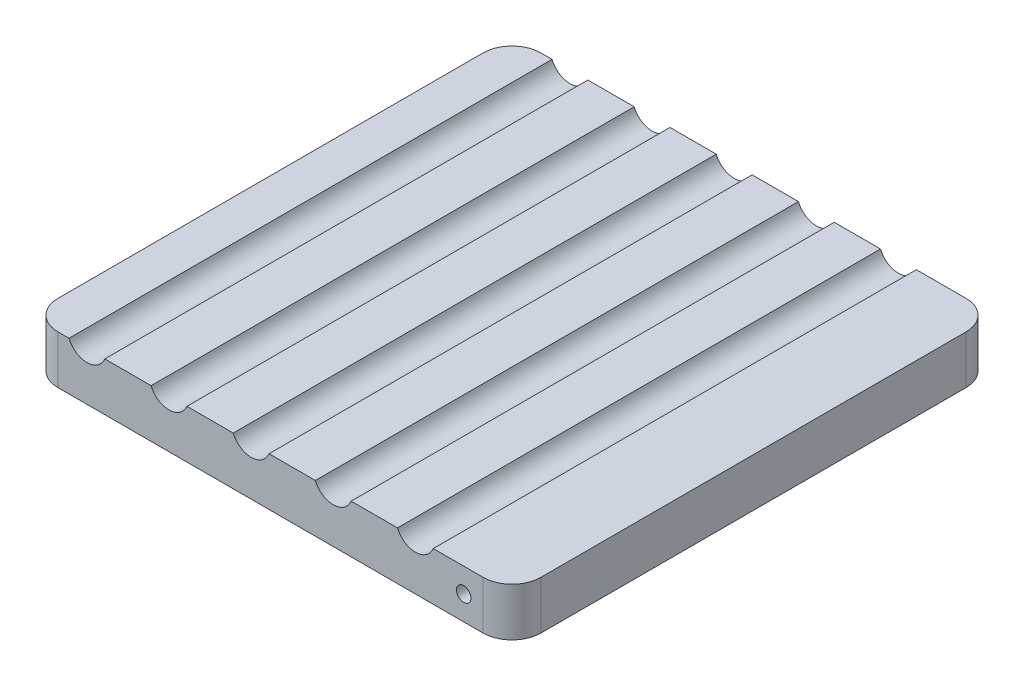
ISO-10303-21;
HEADER;
FILE_DESCRIPTION(('STEP AP214'),'2;1');
FILE_NAME('part.step','',(''),(''),'','','');
FILE_SCHEMA(('AUTOMOTIVE_DESIGN { 1 0 10303 214 1 1 1 1 }'));
ENDSEC;
DATA;
#1=APPLICATION_CONTEXT('core data for automotive mechanical design processes');
#2=APPLICATION_PROTOCOL_DEFINITION('international standard','automotive_design',2000,#1);
#3=PRODUCT_CONTEXT('',#1,'mechanical');
#4=PRODUCT('Part','Part','',(#3));
#5=PRODUCT_RELATED_PRODUCT_CATEGORY('part','',(#4));
#6=PRODUCT_DEFINITION_FORMATION('','',#4);
#7=PRODUCT_DEFINITION_CONTEXT('part definition',#1,'design');
#8=PRODUCT_DEFINITION('design','',#6,#7);
#9=PRODUCT_DEFINITION_SHAPE('','',#8);
#10=(LENGTH_UNIT() NAMED_UNIT(*) SI_UNIT(.MILLI.,.METRE.));
#11=(NAMED_UNIT(*) PLANE_ANGLE_UNIT() SI_UNIT($,.RADIAN.));
#12=(NAMED_UNIT(*) SI_UNIT($,.STERADIAN.) SOLID_ANGLE_UNIT());
#13=UNCERTAINTY_MEASURE_WITH_UNIT(LENGTH_MEASURE(1.E-05),#10,'distance_accuracy_value','');
#14=(GEOMETRIC_REPRESENTATION_CONTEXT(3) GLOBAL_UNCERTAINTY_ASSIGNED_CONTEXT((#13)) GLOBAL_UNIT_ASSIGNED_CONTEXT((#10,
#11,#12)) REPRESENTATION_CONTEXT('',''));
#15=CARTESIAN_POINT('',(0.,0.,0.));
#16=DIRECTION('',(0.,0.,1.));
#17=DIRECTION('',(1.,0.,0.));
#18=AXIS2_PLACEMENT_3D('',#15,#16,#17);
#19=CARTESIAN_POINT('',(0.,12.7,0.));
#20=DIRECTION('',(0.,-1.,0.));
#21=DIRECTION('',(0.,0.,-1.));
#22=AXIS2_PLACEMENT_3D('',#19,#20,#21);
#23=PLANE('',#22);
#24=DIRECTION('',(-1.,0.,0.));
#25=VECTOR('',#24,1.);
#26=CARTESIAN_POINT('',(-63.5,12.7,-63.5));
#27=LINE('',#26,#25);
#28=CARTESIAN_POINT('',(33.3907139606943,12.7,-63.5));
#29=VERTEX_POINT('',#28);
#30=CARTESIAN_POINT('',(21.2192860393058,12.7,-63.5));
#31=VERTEX_POINT('',#30);
#32=EDGE_CURVE('E222',#29,#31,#27,.T.);
#33=ORIENTED_EDGE('',*,*,#32,.T.);
#34=DIRECTION('',(0.,0.,1.));
#35=VECTOR('',#34,1.);
#36=CARTESIAN_POINT('',(21.2192860393058,12.7,-63.5));
#37=LINE('',#36,#35);
#38=CARTESIAN_POINT('',(21.2192860393058,12.7,63.5));
#39=VERTEX_POINT('',#38);
#40=EDGE_CURVE('E13',#31,#39,#37,.T.);
#41=ORIENTED_EDGE('',*,*,#40,.T.);
#42=DIRECTION('',(1.,0.,0.));
#43=VECTOR('',#42,1.);
#44=CARTESIAN_POINT('',(-63.5,12.7,63.5));
#45=LINE('',#44,#43);
#46=CARTESIAN_POINT('',(33.3907139606943,12.7,63.5));
#47=VERTEX_POINT('',#46);
#48=EDGE_CURVE('E206',#39,#47,#45,.T.);
#49=ORIENTED_EDGE('',*,*,#48,.T.);
#50=DIRECTION('',(0.,0.,1.));
#51=VECTOR('',#50,1.);
#52=CARTESIAN_POINT('',(33.3907139606943,12.7,-63.5));
#53=LINE('',#52,#51);
#54=EDGE_CURVE('E345',#47,#29,#53,.F.);
#55=ORIENTED_EDGE('',*,*,#54,.T.);
#56=EDGE_LOOP('',(#33,#41,#49,#55));
#57=FACE_BOUND('',#56,.T.);
#58=ADVANCED_FACE('F54',(#57),#23,.F.);
#59=CARTESIAN_POINT('',(-0.370713960694222,12.7,63.5));
#60=VERTEX_POINT('',#59);
#61=CARTESIAN_POINT('',(11.8007139606943,12.7,63.5));
#62=VERTEX_POINT('',#61);
#63=EDGE_CURVE('E213',#60,#62,#45,.T.);
#64=ORIENTED_EDGE('',*,*,#63,.T.);
#65=DIRECTION('',(0.,0.,1.));
#66=VECTOR('',#65,1.);
#67=CARTESIAN_POINT('',(11.8007139606943,12.7,-63.5));
#68=LINE('',#67,#66);
#69=CARTESIAN_POINT('',(11.8007139606943,12.7,-63.5));
#70=VERTEX_POINT('',#69);
#71=EDGE_CURVE('E62',#62,#70,#68,.F.);
#72=ORIENTED_EDGE('',*,*,#71,.T.);
#73=CARTESIAN_POINT('',(-0.370713960694222,12.7,-63.5));
#74=VERTEX_POINT('',#73);
#75=EDGE_CURVE('E364',#70,#74,#27,.T.);
#76=ORIENTED_EDGE('',*,*,#75,.T.);
#77=DIRECTION('',(0.,0.,1.));
#78=VECTOR('',#77,1.);
#79=CARTESIAN_POINT('',(-0.370713960694222,12.7,-63.5));
#80=LINE('',#79,#78);
#81=EDGE_CURVE('E358',#74,#60,#80,.T.);
#82=ORIENTED_EDGE('',*,*,#81,.T.);
#83=EDGE_LOOP('',(#64,#72,#76,#82));
#84=FACE_BOUND('',#83,.T.);
#85=ADVANCED_FACE('F280',(#84),#23,.F.);
#86=CARTESIAN_POINT('',(-21.9607139606942,12.7,63.5));
#87=VERTEX_POINT('',#86);
#88=CARTESIAN_POINT('',(-9.78928603930573,12.7,63.5));
#89=VERTEX_POINT('',#88);
#90=EDGE_CURVE('E210',#87,#89,#45,.T.);
#91=ORIENTED_EDGE('',*,*,#90,.T.);
#92=DIRECTION('',(0.,0.,1.));
#93=VECTOR('',#92,1.);
#94=CARTESIAN_POINT('',(-9.78928603930573,12.7,-63.5));
#95=LINE('',#94,#93);
#96=CARTESIAN_POINT('',(-9.78928603930573,12.7,-63.5));
#97=VERTEX_POINT('',#96);
#98=EDGE_CURVE('E355',#89,#97,#95,.F.);
#99=ORIENTED_EDGE('',*,*,#98,.T.);
#100=CARTESIAN_POINT('',(-21.9607139606942,12.7,-63.5));
#101=VERTEX_POINT('',#100);
#102=EDGE_CURVE('E370',#97,#101,#27,.T.);
#103=ORIENTED_EDGE('',*,*,#102,.T.);
#104=DIRECTION('',(0.,0.,1.));
#105=VECTOR('',#104,1.);
#106=CARTESIAN_POINT('',(-21.9607139606942,12.7,-63.5));
#107=LINE('',#106,#105);
#108=EDGE_CURVE('E352',#101,#87,#107,.T.);
#109=ORIENTED_EDGE('',*,*,#108,.T.);
#110=EDGE_LOOP('',(#91,#99,#103,#109));
#111=FACE_BOUND('',#110,.T.);
#112=ADVANCED_FACE('F285',(#111),#23,.F.);
#113=CARTESIAN_POINT('',(-43.5507139606942,12.7,63.5));
#114=VERTEX_POINT('',#113);
#115=CARTESIAN_POINT('',(-31.3792860393057,12.7,63.5));
#116=VERTEX_POINT('',#115);
#117=EDGE_CURVE('E197',#114,#116,#45,.T.);
#118=ORIENTED_EDGE('',*,*,#117,.T.);
#119=DIRECTION('',(0.,0.,1.));
#120=VECTOR('',#119,1.);
#121=CARTESIAN_POINT('',(-31.3792860393057,12.7,-63.5));
#122=LINE('',#121,#120);
#123=CARTESIAN_POINT('',(-31.3792860393057,12.7,-63.5));
#124=VERTEX_POINT('',#123);
#125=EDGE_CURVE('E350',#116,#124,#122,.F.);
#126=ORIENTED_EDGE('',*,*,#125,.T.);
#127=CARTESIAN_POINT('',(-43.5507139606942,12.7,-63.5));
#128=VERTEX_POINT('',#127);
#129=EDGE_CURVE('E372',#124,#128,#27,.T.);
#130=ORIENTED_EDGE('',*,*,#129,.T.);
#131=DIRECTION('',(0.,0.,1.));
#132=VECTOR('',#131,1.);
#133=CARTESIAN_POINT('',(-43.5507139606942,12.7,-63.5));
#134=LINE('',#133,#132);
#135=EDGE_CURVE('E184',#128,#114,#134,.T.);
#136=ORIENTED_EDGE('',*,*,#135,.T.);
#137=EDGE_LOOP('',(#118,#126,#130,#136));
#138=FACE_BOUND('',#137,.T.);
#139=ADVANCED_FACE('F402',(#138),#23,.F.);
#140=CARTESIAN_POINT('',(55.88,12.7,-63.5));
#141=VERTEX_POINT('',#140);
#142=CARTESIAN_POINT('',(42.8092860393058,12.7,-63.5));
#143=VERTEX_POINT('',#142);
#144=EDGE_CURVE('E219',#141,#143,#27,.T.);
#145=ORIENTED_EDGE('',*,*,#144,.T.);
#146=DIRECTION('',(0.,0.,1.));
#147=VECTOR('',#146,1.);
#148=CARTESIAN_POINT('',(42.8092860393058,12.7,-63.5));
#149=LINE('',#148,#147);
#150=CARTESIAN_POINT('',(42.8092860393058,12.7,63.5));
#151=VERTEX_POINT('',#150);
#152=EDGE_CURVE('E185',#143,#151,#149,.T.);
#153=ORIENTED_EDGE('',*,*,#152,.T.);
#154=CARTESIAN_POINT('',(55.88,12.7,63.5));
#155=VERTEX_POINT('',#154);
#156=EDGE_CURVE('E207',#151,#155,#45,.T.);
#157=ORIENTED_EDGE('',*,*,#156,.T.);
#158=CARTESIAN_POINT('',(55.88,12.7,55.88));
#159=DIRECTION('',(0.,-1.,0.));
#160=DIRECTION('',(0.,0.,-1.));
#161=AXIS2_PLACEMENT_3D('',#158,#159,#160);
#162=CIRCLE('',#161,7.62);
#163=CARTESIAN_POINT('',(63.5,12.7,55.88));
#164=VERTEX_POINT('',#163);
#165=EDGE_CURVE('E329',#155,#164,#162,.F.);
#166=ORIENTED_EDGE('',*,*,#165,.T.);
#167=DIRECTION('',(0.,0.,-1.));
#168=VECTOR('',#167,1.);
#169=CARTESIAN_POINT('',(63.5,12.7,63.5));
#170=LINE('',#169,#168);
#171=CARTESIAN_POINT('',(63.5,12.7,-55.88));
#172=VERTEX_POINT('',#171);
#173=EDGE_CURVE('E226',#164,#172,#170,.T.);
#174=ORIENTED_EDGE('',*,*,#173,.T.);
#175=CARTESIAN_POINT('',(55.88,12.7,-55.88));
#176=DIRECTION('',(0.,-1.,0.));
#177=DIRECTION('',(0.,0.,-1.));
#178=AXIS2_PLACEMENT_3D('',#175,#176,#177);
#179=CIRCLE('',#178,7.62);
#180=EDGE_CURVE('E331',#172,#141,#179,.F.);
#181=ORIENTED_EDGE('',*,*,#180,.T.);
#182=EDGE_LOOP('',(#145,#153,#157,#166,#174,#181));
#183=FACE_BOUND('',#182,.T.);
#184=ADVANCED_FACE('F275',(#183),#23,.F.);
#185=CARTESIAN_POINT('',(63.5,12.7,63.5));
#186=DIRECTION('',(-1.,0.,0.));
#187=DIRECTION('',(0.,0.,1.));
#188=AXIS2_PLACEMENT_3D('',#185,#186,#187);
#189=PLANE('',#188);
#190=DIRECTION('',(0.,0.,-1.));
#191=VECTOR('',#190,1.);
#192=CARTESIAN_POINT('',(63.5,0.,63.5));
#193=LINE('',#192,#191);
#194=CARTESIAN_POINT('',(63.5,0.,55.88));
#195=VERTEX_POINT('',#194);
#196=CARTESIAN_POINT('',(63.5,0.,-55.88));
#197=VERTEX_POINT('',#196);
#198=EDGE_CURVE('E235',#195,#197,#193,.T.);
#199=ORIENTED_EDGE('',*,*,#198,.T.);
#200=DIRECTION('',(0.,-1.,0.));
#201=VECTOR('',#200,1.);
#202=CARTESIAN_POINT('',(63.5,12.7,-55.88));
#203=LINE('',#202,#201);
#204=EDGE_CURVE('E343',#197,#172,#203,.F.);
#205=ORIENTED_EDGE('',*,*,#204,.T.);
#206=ORIENTED_EDGE('',*,*,#173,.F.);
#207=DIRECTION('',(0.,-1.,0.));
#208=VECTOR('',#207,1.);
#209=CARTESIAN_POINT('',(63.5,12.7,55.88));
#210=LINE('',#209,#208);
#211=EDGE_CURVE('E340',#164,#195,#210,.T.);
#212=ORIENTED_EDGE('',*,*,#211,.T.);
#213=EDGE_LOOP('',(#199,#205,#206,#212));
#214=FACE_BOUND('',#213,.T.);
#215=ADVANCED_FACE('F389',(#214),#189,.F.);
#216=CARTESIAN_POINT('',(-63.5,12.7,-63.5));
#217=DIRECTION('',(0.,0.,1.));
#218=DIRECTION('',(1.,0.,0.));
#219=AXIS2_PLACEMENT_3D('',#216,#217,#218);
#220=PLANE('',#219);
#221=CARTESIAN_POINT('',(50.8,6.35,-63.5));
#222=DIRECTION('',(0.,0.,1.));
#223=DIRECTION('',(1.,0.,0.));
#224=AXIS2_PLACEMENT_3D('',#221,#222,#223);
#225=CIRCLE('',#224,1.905);
#226=CARTESIAN_POINT('',(52.705,6.35,-63.5));
#227=VERTEX_POINT('',#226);
#228=EDGE_CURVE('E198',#227,#227,#225,.T.);
#229=ORIENTED_EDGE('',*,*,#228,.T.);
#230=EDGE_LOOP('',(#229));
#231=FACE_BOUND('',#230,.T.);
#232=ORIENTED_EDGE('',*,*,#75,.F.);
#233=CARTESIAN_POINT('',(16.51,14.605,-63.5));
#234=DIRECTION('',(0.,0.,1.));
#235=DIRECTION('',(1.,0.,0.));
#236=AXIS2_PLACEMENT_3D('',#233,#234,#235);
#237=CIRCLE('',#236,5.08);
#238=EDGE_CURVE('E233',#70,#31,#237,.T.);
#239=ORIENTED_EDGE('',*,*,#238,.T.);
#240=ORIENTED_EDGE('',*,*,#32,.F.);
#241=CARTESIAN_POINT('',(38.1,14.605,-63.5));
#242=DIRECTION('',(0.,0.,1.));
#243=DIRECTION('',(1.,0.,0.));
#244=AXIS2_PLACEMENT_3D('',#241,#242,#243);
#245=CIRCLE('',#244,5.08);
#246=EDGE_CURVE('E232',#29,#143,#245,.T.);
#247=ORIENTED_EDGE('',*,*,#246,.T.);
#248=ORIENTED_EDGE('',*,*,#144,.F.);
#249=DIRECTION('',(0.,-1.,0.));
#250=VECTOR('',#249,1.);
#251=CARTESIAN_POINT('',(55.88,12.7,-63.5));
#252=LINE('',#251,#250);
#253=CARTESIAN_POINT('',(55.88,0.,-63.5));
#254=VERTEX_POINT('',#253);
#255=EDGE_CURVE('E323',#141,#254,#252,.T.);
#256=ORIENTED_EDGE('',*,*,#255,.T.);
#257=DIRECTION('',(-1.,0.,0.));
#258=VECTOR('',#257,1.);
#259=CARTESIAN_POINT('',(-63.5,0.,-63.5));
#260=LINE('',#259,#258);
#261=CARTESIAN_POINT('',(-55.88,0.,-63.5));
#262=VERTEX_POINT('',#261);
#263=EDGE_CURVE('E310',#254,#262,#260,.T.);
#264=ORIENTED_EDGE('',*,*,#263,.T.);
#265=DIRECTION('',(0.,-1.,0.));
#266=VECTOR('',#265,1.);
#267=CARTESIAN_POINT('',(-55.88,12.7,-63.5));
#268=LINE('',#267,#266);
#269=CARTESIAN_POINT('',(-55.88,12.7,-63.5));
#270=VERTEX_POINT('',#269);
#271=EDGE_CURVE('E326',#262,#270,#268,.F.);
#272=ORIENTED_EDGE('',*,*,#271,.T.);
#273=CARTESIAN_POINT('',(-52.9692860393057,12.7,-63.5));
#274=VERTEX_POINT('',#273);
#275=EDGE_CURVE('E224',#274,#270,#27,.T.);
#276=ORIENTED_EDGE('',*,*,#275,.F.);
#277=CARTESIAN_POINT('',(-48.26,14.605,-63.5));
#278=DIRECTION('',(0.,0.,1.));
#279=DIRECTION('',(1.,0.,0.));
#280=AXIS2_PLACEMENT_3D('',#277,#278,#279);
#281=CIRCLE('',#280,5.08);
#282=EDGE_CURVE('E69',#274,#128,#281,.T.);
#283=ORIENTED_EDGE('',*,*,#282,.T.);
#284=ORIENTED_EDGE('',*,*,#129,.F.);
#285=CARTESIAN_POINT('',(-26.67,14.605,-63.5));
#286=DIRECTION('',(0.,0.,1.));
#287=DIRECTION('',(1.,0.,0.));
#288=AXIS2_PLACEMENT_3D('',#285,#286,#287);
#289=CIRCLE('',#288,5.08);
#290=EDGE_CURVE('E77',#124,#101,#289,.T.);
#291=ORIENTED_EDGE('',*,*,#290,.T.);
#292=ORIENTED_EDGE('',*,*,#102,.F.);
#293=CARTESIAN_POINT('',(-5.07999999999997,14.605,-63.5));
#294=DIRECTION('',(0.,0.,1.));
#295=DIRECTION('',(1.,0.,0.));
#296=AXIS2_PLACEMENT_3D('',#293,#294,#295);
#297=CIRCLE('',#296,5.08);
#298=EDGE_CURVE('E243',#97,#74,#297,.T.);
#299=ORIENTED_EDGE('',*,*,#298,.T.);
#300=EDGE_LOOP('',(#232,#239,#240,#247,#248,#256,#264,#272,#276,#283,#284,#291,#292,#299));
#301=FACE_BOUND('',#300,.T.);
#302=ADVANCED_FACE('F256',(#231,#301),#220,.F.);
#303=CARTESIAN_POINT('',(-63.5,12.7,63.5));
#304=DIRECTION('',(1.,0.,0.));
#305=DIRECTION('',(0.,0.,-1.));
#306=AXIS2_PLACEMENT_3D('',#303,#304,#305);
#307=PLANE('',#306);
#308=DIRECTION('',(0.,0.,1.));
#309=VECTOR('',#308,1.);
#310=CARTESIAN_POINT('',(-63.5,12.7,63.5));
#311=LINE('',#310,#309);
#312=CARTESIAN_POINT('',(-63.5,12.7,-55.88));
#313=VERTEX_POINT('',#312);
#314=CARTESIAN_POINT('',(-63.5,12.7,55.88));
#315=VERTEX_POINT('',#314);
#316=EDGE_CURVE('E214',#313,#315,#311,.T.);
#317=ORIENTED_EDGE('',*,*,#316,.F.);
#318=DIRECTION('',(0.,-1.,0.));
#319=VECTOR('',#318,1.);
#320=CARTESIAN_POINT('',(-63.5,12.7,-55.88));
#321=LINE('',#320,#319);
#322=CARTESIAN_POINT('',(-63.5,0.,-55.88));
#323=VERTEX_POINT('',#322);
#324=EDGE_CURVE('E208',#313,#323,#321,.T.);
#325=ORIENTED_EDGE('',*,*,#324,.T.);
#326=DIRECTION('',(0.,0.,1.));
#327=VECTOR('',#326,1.);
#328=CARTESIAN_POINT('',(-63.5,0.,63.5));
#329=LINE('',#328,#327);
#330=CARTESIAN_POINT('',(-63.5,0.,55.88));
#331=VERTEX_POINT('',#330);
#332=EDGE_CURVE('E302',#323,#331,#329,.T.);
#333=ORIENTED_EDGE('',*,*,#332,.T.);
#334=DIRECTION('',(0.,-1.,0.));
#335=VECTOR('',#334,1.);
#336=CARTESIAN_POINT('',(-63.5,12.7,55.88));
#337=LINE('',#336,#335);
#338=EDGE_CURVE('E204',#331,#315,#337,.F.);
#339=ORIENTED_EDGE('',*,*,#338,.T.);
#340=EDGE_LOOP('',(#317,#325,#333,#339));
#341=FACE_BOUND('',#340,.T.);
#342=ADVANCED_FACE('F267',(#341),#307,.F.);
#343=CARTESIAN_POINT('',(-63.5,12.7,63.5));
#344=DIRECTION('',(0.,0.,-1.));
#345=DIRECTION('',(-1.,0.,0.));
#346=AXIS2_PLACEMENT_3D('',#343,#344,#345);
#347=PLANE('',#346);
#348=CARTESIAN_POINT('',(50.8,6.35,63.5));
#349=DIRECTION('',(0.,0.,1.));
#350=DIRECTION('',(1.,0.,0.));
#351=AXIS2_PLACEMENT_3D('',#348,#349,#350);
#352=CIRCLE('',#351,1.905);
#353=CARTESIAN_POINT('',(52.705,6.35,63.5));
#354=VERTEX_POINT('',#353);
#355=EDGE_CURVE('E250',#354,#354,#352,.T.);
#356=ORIENTED_EDGE('',*,*,#355,.F.);
#357=EDGE_LOOP('',(#356));
#358=FACE_BOUND('',#357,.T.);
#359=ORIENTED_EDGE('',*,*,#48,.F.);
#360=CARTESIAN_POINT('',(16.51,14.605,63.5));
#361=DIRECTION('',(0.,0.,1.));
#362=DIRECTION('',(1.,0.,0.));
#363=AXIS2_PLACEMENT_3D('',#360,#361,#362);
#364=CIRCLE('',#363,5.08);
#365=EDGE_CURVE('E246',#62,#39,#364,.T.);
#366=ORIENTED_EDGE('',*,*,#365,.F.);
#367=ORIENTED_EDGE('',*,*,#63,.F.);
#368=CARTESIAN_POINT('',(-5.07999999999997,14.605,63.5));
#369=DIRECTION('',(0.,0.,1.));
#370=DIRECTION('',(1.,0.,0.));
#371=AXIS2_PLACEMENT_3D('',#368,#369,#370);
#372=CIRCLE('',#371,5.08);
#373=EDGE_CURVE('E241',#89,#60,#372,.T.);
#374=ORIENTED_EDGE('',*,*,#373,.F.);
#375=ORIENTED_EDGE('',*,*,#90,.F.);
#376=CARTESIAN_POINT('',(-26.67,14.605,63.5));
#377=DIRECTION('',(0.,0.,1.));
#378=DIRECTION('',(1.,0.,0.));
#379=AXIS2_PLACEMENT_3D('',#376,#377,#378);
#380=CIRCLE('',#379,5.08);
#381=EDGE_CURVE('E238',#116,#87,#380,.T.);
#382=ORIENTED_EDGE('',*,*,#381,.F.);
#383=ORIENTED_EDGE('',*,*,#117,.F.);
#384=CARTESIAN_POINT('',(-48.26,14.605,63.5));
#385=DIRECTION('',(0.,0.,1.));
#386=DIRECTION('',(1.,0.,0.));
#387=AXIS2_PLACEMENT_3D('',#384,#385,#386);
#388=CIRCLE('',#387,5.08);
#389=CARTESIAN_POINT('',(-52.9692860393057,12.7,63.5));
#390=VERTEX_POINT('',#389);
#391=EDGE_CURVE('E179',#390,#114,#388,.T.);
#392=ORIENTED_EDGE('',*,*,#391,.F.);
#393=CARTESIAN_POINT('',(-55.88,12.7,63.5));
#394=VERTEX_POINT('',#393);
#395=EDGE_CURVE('E193',#394,#390,#45,.T.);
#396=ORIENTED_EDGE('',*,*,#395,.F.);
#397=DIRECTION('',(0.,-1.,0.));
#398=VECTOR('',#397,1.);
#399=CARTESIAN_POINT('',(-55.88,12.7,63.5));
#400=LINE('',#399,#398);
#401=CARTESIAN_POINT('',(-55.88,0.,63.5));
#402=VERTEX_POINT('',#401);
#403=EDGE_CURVE('E338',#394,#402,#400,.T.);
#404=ORIENTED_EDGE('',*,*,#403,.T.);
#405=DIRECTION('',(1.,0.,0.));
#406=VECTOR('',#405,1.);
#407=CARTESIAN_POINT('',(-63.5,0.,63.5));
#408=LINE('',#407,#406);
#409=CARTESIAN_POINT('',(55.88,0.,63.5));
#410=VERTEX_POINT('',#409);
#411=EDGE_CURVE('E229',#402,#410,#408,.T.);
#412=ORIENTED_EDGE('',*,*,#411,.T.);
#413=DIRECTION('',(0.,-1.,0.));
#414=VECTOR('',#413,1.);
#415=CARTESIAN_POINT('',(55.88,12.7,63.5));
#416=LINE('',#415,#414);
#417=EDGE_CURVE('E336',#410,#155,#416,.F.);
#418=ORIENTED_EDGE('',*,*,#417,.T.);
#419=ORIENTED_EDGE('',*,*,#156,.F.);
#420=CARTESIAN_POINT('',(38.1,14.605,63.5));
#421=DIRECTION('',(0.,0.,1.));
#422=DIRECTION('',(1.,0.,0.));
#423=AXIS2_PLACEMENT_3D('',#420,#421,#422);
#424=CIRCLE('',#423,5.08);
#425=EDGE_CURVE('E230',#47,#151,#424,.T.);
#426=ORIENTED_EDGE('',*,*,#425,.F.);
#427=EDGE_LOOP('',(#359,#366,#367,#374,#375,#382,#383,#392,#396,#404,#412,#418,#419,#426));
#428=FACE_BOUND('',#427,.T.);
#429=ADVANCED_FACE('F191',(#358,#428),#347,.F.);
#430=ORIENTED_EDGE('',*,*,#395,.T.);
#431=DIRECTION('',(0.,0.,1.));
#432=VECTOR('',#431,1.);
#433=CARTESIAN_POINT('',(-52.9692860393057,12.7,-63.5));
#434=LINE('',#433,#432);
#435=EDGE_CURVE('E176',#390,#274,#434,.F.);
#436=ORIENTED_EDGE('',*,*,#435,.T.);
#437=ORIENTED_EDGE('',*,*,#275,.T.);
#438=CARTESIAN_POINT('',(-55.88,12.7,-55.88));
#439=DIRECTION('',(0.,-1.,0.));
#440=DIRECTION('',(0.,0.,-1.));
#441=AXIS2_PLACEMENT_3D('',#438,#439,#440);
#442=CIRCLE('',#441,7.62);
#443=EDGE_CURVE('E334',#270,#313,#442,.F.);
#444=ORIENTED_EDGE('',*,*,#443,.T.);
#445=ORIENTED_EDGE('',*,*,#316,.T.);
#446=CARTESIAN_POINT('',(-55.88,12.7,55.88));
#447=DIRECTION('',(0.,-1.,0.));
#448=DIRECTION('',(0.,0.,-1.));
#449=AXIS2_PLACEMENT_3D('',#446,#447,#448);
#450=CIRCLE('',#449,7.62);
#451=EDGE_CURVE('E203',#315,#394,#450,.F.);
#452=ORIENTED_EDGE('',*,*,#451,.T.);
#453=EDGE_LOOP('',(#430,#436,#437,#444,#445,#452));
#454=FACE_BOUND('',#453,.T.);
#455=ADVANCED_FACE('F200',(#454),#23,.F.);
#456=CARTESIAN_POINT('',(0.,0.,0.));
#457=DIRECTION('',(0.,-1.,0.));
#458=DIRECTION('',(0.,0.,-1.));
#459=AXIS2_PLACEMENT_3D('',#456,#457,#458);
#460=PLANE('',#459);
#461=ORIENTED_EDGE('',*,*,#332,.F.);
#462=CARTESIAN_POINT('',(-55.88,0.,-55.88));
#463=DIRECTION('',(0.,-1.,0.));
#464=DIRECTION('',(0.,0.,-1.));
#465=AXIS2_PLACEMENT_3D('',#462,#463,#464);
#466=CIRCLE('',#465,7.62);
#467=EDGE_CURVE('E304',#323,#262,#466,.T.);
#468=ORIENTED_EDGE('',*,*,#467,.T.);
#469=ORIENTED_EDGE('',*,*,#263,.F.);
#470=CARTESIAN_POINT('',(55.88,0.,-55.88));
#471=DIRECTION('',(0.,-1.,0.));
#472=DIRECTION('',(0.,0.,-1.));
#473=AXIS2_PLACEMENT_3D('',#470,#471,#472);
#474=CIRCLE('',#473,7.62);
#475=EDGE_CURVE('E319',#254,#197,#474,.T.);
#476=ORIENTED_EDGE('',*,*,#475,.T.);
#477=ORIENTED_EDGE('',*,*,#198,.F.);
#478=CARTESIAN_POINT('',(55.88,0.,55.88));
#479=DIRECTION('',(0.,-1.,0.));
#480=DIRECTION('',(0.,0.,-1.));
#481=AXIS2_PLACEMENT_3D('',#478,#479,#480);
#482=CIRCLE('',#481,7.62);
#483=EDGE_CURVE('E317',#195,#410,#482,.T.);
#484=ORIENTED_EDGE('',*,*,#483,.T.);
#485=ORIENTED_EDGE('',*,*,#411,.F.);
#486=CARTESIAN_POINT('',(-55.88,0.,55.88));
#487=DIRECTION('',(0.,-1.,0.));
#488=DIRECTION('',(0.,0.,-1.));
#489=AXIS2_PLACEMENT_3D('',#486,#487,#488);
#490=CIRCLE('',#489,7.62);
#491=EDGE_CURVE('E307',#402,#331,#490,.T.);
#492=ORIENTED_EDGE('',*,*,#491,.T.);
#493=EDGE_LOOP('',(#461,#468,#469,#476,#477,#484,#485,#492));
#494=FACE_BOUND('',#493,.T.);
#495=ADVANCED_FACE('F273',(#494),#460,.T.);
#496=CARTESIAN_POINT('',(-55.88,12.7,-55.88));
#497=DIRECTION('',(0.,-1.,0.));
#498=DIRECTION('',(0.,0.,-1.));
#499=AXIS2_PLACEMENT_3D('',#496,#497,#498);
#500=CYLINDRICAL_SURFACE('',#499,7.62);
#501=ORIENTED_EDGE('',*,*,#443,.F.);
#502=ORIENTED_EDGE('',*,*,#271,.F.);
#503=ORIENTED_EDGE('',*,*,#467,.F.);
#504=ORIENTED_EDGE('',*,*,#324,.F.);
#505=EDGE_LOOP('',(#501,#502,#503,#504));
#506=FACE_BOUND('',#505,.T.);
#507=ADVANCED_FACE('F292',(#506),#500,.T.);
#508=CARTESIAN_POINT('',(-55.88,12.7,55.88));
#509=DIRECTION('',(0.,-1.,0.));
#510=DIRECTION('',(0.,0.,-1.));
#511=AXIS2_PLACEMENT_3D('',#508,#509,#510);
#512=CYLINDRICAL_SURFACE('',#511,7.62);
#513=ORIENTED_EDGE('',*,*,#451,.F.);
#514=ORIENTED_EDGE('',*,*,#338,.F.);
#515=ORIENTED_EDGE('',*,*,#491,.F.);
#516=ORIENTED_EDGE('',*,*,#403,.F.);
#517=EDGE_LOOP('',(#513,#514,#515,#516));
#518=FACE_BOUND('',#517,.T.);
#519=ADVANCED_FACE('F297',(#518),#512,.T.);
#520=CARTESIAN_POINT('',(55.88,12.7,-55.88));
#521=DIRECTION('',(0.,-1.,0.));
#522=DIRECTION('',(0.,0.,-1.));
#523=AXIS2_PLACEMENT_3D('',#520,#521,#522);
#524=CYLINDRICAL_SURFACE('',#523,7.62);
#525=ORIENTED_EDGE('',*,*,#180,.F.);
#526=ORIENTED_EDGE('',*,*,#204,.F.);
#527=ORIENTED_EDGE('',*,*,#475,.F.);
#528=ORIENTED_EDGE('',*,*,#255,.F.);
#529=EDGE_LOOP('',(#525,#526,#527,#528));
#530=FACE_BOUND('',#529,.T.);
#531=ADVANCED_FACE('F395',(#530),#524,.T.);
#532=CARTESIAN_POINT('',(55.88,12.7,55.88));
#533=DIRECTION('',(0.,-1.,0.));
#534=DIRECTION('',(0.,0.,-1.));
#535=AXIS2_PLACEMENT_3D('',#532,#533,#534);
#536=CYLINDRICAL_SURFACE('',#535,7.62);
#537=ORIENTED_EDGE('',*,*,#165,.F.);
#538=ORIENTED_EDGE('',*,*,#417,.F.);
#539=ORIENTED_EDGE('',*,*,#483,.F.);
#540=ORIENTED_EDGE('',*,*,#211,.F.);
#541=EDGE_LOOP('',(#537,#538,#539,#540));
#542=FACE_BOUND('',#541,.T.);
#543=ADVANCED_FACE('F56',(#542),#536,.T.);
#544=CARTESIAN_POINT('',(38.1,14.605,-63.5));
#545=DIRECTION('',(0.,0.,1.));
#546=DIRECTION('',(1.,0.,0.));
#547=AXIS2_PLACEMENT_3D('',#544,#545,#546);
#548=CYLINDRICAL_SURFACE('',#547,5.08);
#549=ORIENTED_EDGE('',*,*,#246,.F.);
#550=ORIENTED_EDGE('',*,*,#54,.F.);
#551=ORIENTED_EDGE('',*,*,#425,.T.);
#552=ORIENTED_EDGE('',*,*,#152,.F.);
#553=EDGE_LOOP('',(#549,#550,#551,#552));
#554=FACE_BOUND('',#553,.T.);
#555=ADVANCED_FACE('F289',(#554),#548,.F.);
#556=CARTESIAN_POINT('',(-48.26,14.605,-63.5));
#557=DIRECTION('',(0.,0.,1.));
#558=DIRECTION('',(1.,0.,0.));
#559=AXIS2_PLACEMENT_3D('',#556,#557,#558);
#560=CYLINDRICAL_SURFACE('',#559,5.08);
#561=ORIENTED_EDGE('',*,*,#282,.F.);
#562=ORIENTED_EDGE('',*,*,#435,.F.);
#563=ORIENTED_EDGE('',*,*,#391,.T.);
#564=ORIENTED_EDGE('',*,*,#135,.F.);
#565=EDGE_LOOP('',(#561,#562,#563,#564));
#566=FACE_BOUND('',#565,.T.);
#567=ADVANCED_FACE('F178',(#566),#560,.F.);
#568=CARTESIAN_POINT('',(-26.67,14.605,-63.5));
#569=DIRECTION('',(0.,0.,1.));
#570=DIRECTION('',(1.,0.,0.));
#571=AXIS2_PLACEMENT_3D('',#568,#569,#570);
#572=CYLINDRICAL_SURFACE('',#571,5.08);
#573=ORIENTED_EDGE('',*,*,#290,.F.);
#574=ORIENTED_EDGE('',*,*,#125,.F.);
#575=ORIENTED_EDGE('',*,*,#381,.T.);
#576=ORIENTED_EDGE('',*,*,#108,.F.);
#577=EDGE_LOOP('',(#573,#574,#575,#576));
#578=FACE_BOUND('',#577,.T.);
#579=ADVANCED_FACE('F403',(#578),#572,.F.);
#580=CARTESIAN_POINT('',(-5.07999999999997,14.605,-63.5));
#581=DIRECTION('',(0.,0.,1.));
#582=DIRECTION('',(1.,0.,0.));
#583=AXIS2_PLACEMENT_3D('',#580,#581,#582);
#584=CYLINDRICAL_SURFACE('',#583,5.08);
#585=ORIENTED_EDGE('',*,*,#298,.F.);
#586=ORIENTED_EDGE('',*,*,#98,.F.);
#587=ORIENTED_EDGE('',*,*,#373,.T.);
#588=ORIENTED_EDGE('',*,*,#81,.F.);
#589=EDGE_LOOP('',(#585,#586,#587,#588));
#590=FACE_BOUND('',#589,.T.);
#591=ADVANCED_FACE('F405',(#590),#584,.F.);
#592=CARTESIAN_POINT('',(16.51,14.605,-63.5));
#593=DIRECTION('',(0.,0.,1.));
#594=DIRECTION('',(1.,0.,0.));
#595=AXIS2_PLACEMENT_3D('',#592,#593,#594);
#596=CYLINDRICAL_SURFACE('',#595,5.08);
#597=ORIENTED_EDGE('',*,*,#238,.F.);
#598=ORIENTED_EDGE('',*,*,#71,.F.);
#599=ORIENTED_EDGE('',*,*,#365,.T.);
#600=ORIENTED_EDGE('',*,*,#40,.F.);
#601=EDGE_LOOP('',(#597,#598,#599,#600));
#602=FACE_BOUND('',#601,.T.);
#603=ADVANCED_FACE('F262',(#602),#596,.F.);
#604=CARTESIAN_POINT('',(50.8,6.35,-63.5));
#605=DIRECTION('',(0.,0.,1.));
#606=DIRECTION('',(1.,0.,0.));
#607=AXIS2_PLACEMENT_3D('',#604,#605,#606);
#608=CYLINDRICAL_SURFACE('',#607,1.905);
#609=ORIENTED_EDGE('',*,*,#228,.F.);
#610=EDGE_LOOP('',(#609));
#611=FACE_BOUND('',#610,.T.);
#612=ORIENTED_EDGE('',*,*,#355,.T.);
#613=EDGE_LOOP('',(#612));
#614=FACE_BOUND('',#613,.T.);
#615=ADVANCED_FACE('F259',(#611,#614),#608,.F.);
#616=CLOSED_SHELL('',(#58,#85,#112,#139,#184,#215,#302,#342,#429,#455,#495,#507,#519,#531,#543,
#555,#567,#579,#591,#603,#615));
#617=MANIFOLD_SOLID_BREP('B2',#616);
#618=ADVANCED_BREP_SHAPE_REPRESENTATION('',(#18,#617),#14);
#619=SHAPE_DEFINITION_REPRESENTATION(#9,#618);
ENDSEC;
END-ISO-10303-21;
